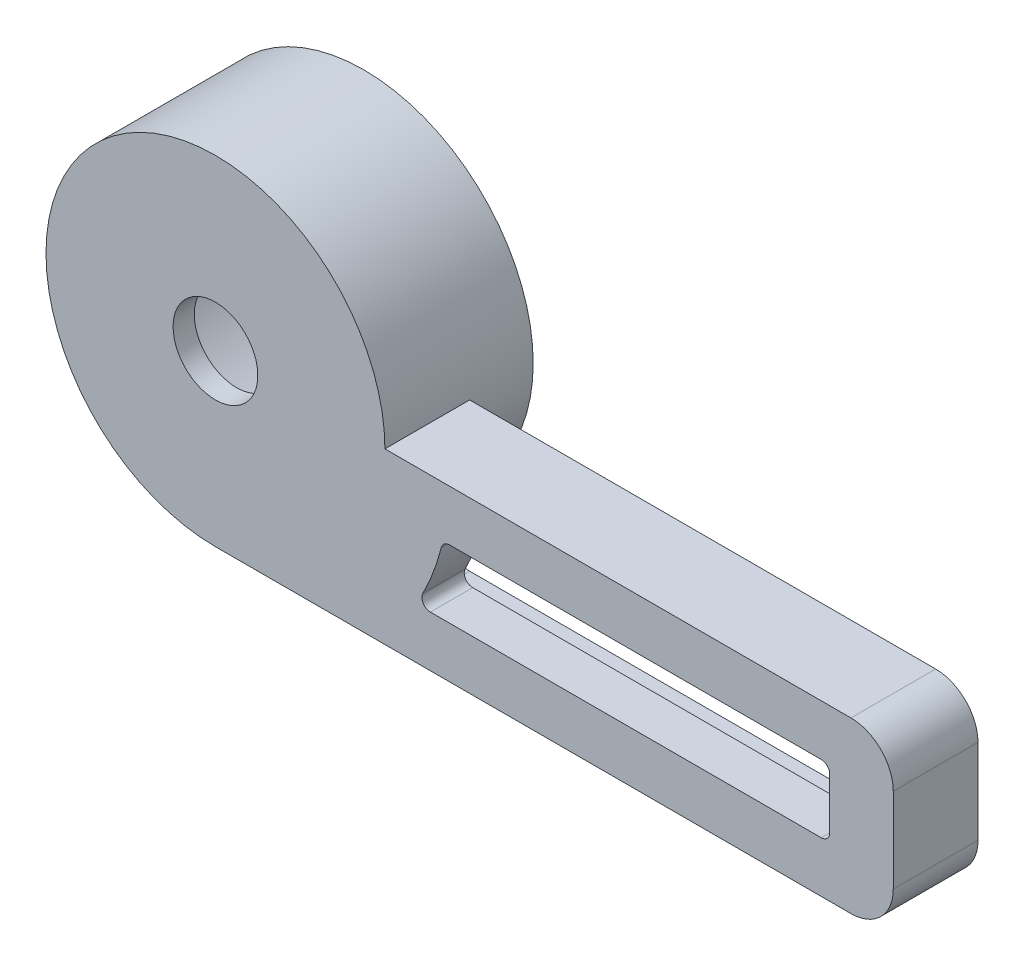
ISO-10303-21;
HEADER;
FILE_DESCRIPTION(('STEP AP214'),'2;1');
FILE_NAME('part.step','',(''),(''),'','','');
FILE_SCHEMA(('AUTOMOTIVE_DESIGN { 1 0 10303 214 1 1 1 1 }'));
ENDSEC;
DATA;
#1=APPLICATION_CONTEXT('core data for automotive mechanical design processes');
#2=APPLICATION_PROTOCOL_DEFINITION('international standard','automotive_design',2000,#1);
#3=PRODUCT_CONTEXT('',#1,'mechanical');
#4=PRODUCT('Part','Part','',(#3));
#5=PRODUCT_RELATED_PRODUCT_CATEGORY('part','',(#4));
#6=PRODUCT_DEFINITION_FORMATION('','',#4);
#7=PRODUCT_DEFINITION_CONTEXT('part definition',#1,'design');
#8=PRODUCT_DEFINITION('design','',#6,#7);
#9=PRODUCT_DEFINITION_SHAPE('','',#8);
#10=(LENGTH_UNIT() NAMED_UNIT(*) SI_UNIT(.MILLI.,.METRE.));
#11=(NAMED_UNIT(*) PLANE_ANGLE_UNIT() SI_UNIT($,.RADIAN.));
#12=(NAMED_UNIT(*) SI_UNIT($,.STERADIAN.) SOLID_ANGLE_UNIT());
#13=UNCERTAINTY_MEASURE_WITH_UNIT(LENGTH_MEASURE(1.E-05),#10,'distance_accuracy_value','');
#14=(GEOMETRIC_REPRESENTATION_CONTEXT(3) GLOBAL_UNCERTAINTY_ASSIGNED_CONTEXT((#13)) GLOBAL_UNIT_ASSIGNED_CONTEXT((#10,
#11,#12)) REPRESENTATION_CONTEXT('',''));
#15=CARTESIAN_POINT('',(0.,0.,0.));
#16=DIRECTION('',(0.,0.,1.));
#17=DIRECTION('',(1.,0.,0.));
#18=AXIS2_PLACEMENT_3D('',#15,#16,#17);
#19=CARTESIAN_POINT('',(-60.,20.,-20.));
#20=DIRECTION('',(0.,-1.,0.));
#21=DIRECTION('',(0.,0.,-1.));
#22=AXIS2_PLACEMENT_3D('',#19,#20,#21);
#23=PLANE('',#22);
#24=DIRECTION('',(1.,0.,0.));
#25=VECTOR('',#24,1.);
#26=CARTESIAN_POINT('',(-60.,20.,-20.));
#27=LINE('',#26,#25);
#28=CARTESIAN_POINT('',(-20.,20.,-20.));
#29=VERTEX_POINT('',#28);
#30=CARTESIAN_POINT('',(89.9999999999999,20.,-20.));
#31=VERTEX_POINT('',#30);
#32=EDGE_CURVE('E360',#29,#31,#27,.T.);
#33=ORIENTED_EDGE('',*,*,#32,.F.);
#34=DIRECTION('',(0.,0.,1.));
#35=VECTOR('',#34,1.);
#36=CARTESIAN_POINT('',(-20.,20.,-35.));
#37=LINE('',#36,#35);
#38=CARTESIAN_POINT('',(-20.,20.,0.));
#39=VERTEX_POINT('',#38);
#40=EDGE_CURVE('E336',#29,#39,#37,.T.);
#41=ORIENTED_EDGE('',*,*,#40,.T.);
#42=DIRECTION('',(1.,0.,0.));
#43=VECTOR('',#42,1.);
#44=CARTESIAN_POINT('',(-60.,20.,0.));
#45=LINE('',#44,#43);
#46=CARTESIAN_POINT('',(89.9999999999999,20.,0.));
#47=VERTEX_POINT('',#46);
#48=EDGE_CURVE('E348',#39,#47,#45,.T.);
#49=ORIENTED_EDGE('',*,*,#48,.T.);
#50=DIRECTION('',(0.,0.,1.));
#51=VECTOR('',#50,1.);
#52=CARTESIAN_POINT('',(89.9999999999999,20.,-20.));
#53=LINE('',#52,#51);
#54=EDGE_CURVE('E11',#31,#47,#53,.T.);
#55=ORIENTED_EDGE('',*,*,#54,.F.);
#56=EDGE_LOOP('',(#33,#41,#49,#55));
#57=FACE_BOUND('',#56,.T.);
#58=ADVANCED_FACE('F38',(#57),#23,.F.);
#59=CARTESIAN_POINT('',(90.,10.,-20.));
#60=DIRECTION('',(0.,0.,1.));
#61=DIRECTION('',(1.,0.,0.));
#62=AXIS2_PLACEMENT_3D('',#59,#60,#61);
#63=CYLINDRICAL_SURFACE('',#62,10.);
#64=CARTESIAN_POINT('',(90.,10.,0.));
#65=DIRECTION('',(0.,0.,-1.));
#66=DIRECTION('',(-1.,0.,0.));
#67=AXIS2_PLACEMENT_3D('',#64,#65,#66);
#68=CIRCLE('',#67,10.);
#69=CARTESIAN_POINT('',(100.,9.99999999999993,0.));
#70=VERTEX_POINT('',#69);
#71=EDGE_CURVE('E345',#47,#70,#68,.T.);
#72=ORIENTED_EDGE('',*,*,#71,.T.);
#73=DIRECTION('',(0.,0.,1.));
#74=VECTOR('',#73,1.);
#75=CARTESIAN_POINT('',(100.,9.99999999999993,-20.));
#76=LINE('',#75,#74);
#77=CARTESIAN_POINT('',(100.,9.99999999999993,-20.));
#78=VERTEX_POINT('',#77);
#79=EDGE_CURVE('E47',#78,#70,#76,.T.);
#80=ORIENTED_EDGE('',*,*,#79,.F.);
#81=CARTESIAN_POINT('',(90.,10.,-20.));
#82=DIRECTION('',(0.,0.,-1.));
#83=DIRECTION('',(-1.,0.,0.));
#84=AXIS2_PLACEMENT_3D('',#81,#82,#83);
#85=CIRCLE('',#84,10.);
#86=EDGE_CURVE('E358',#31,#78,#85,.T.);
#87=ORIENTED_EDGE('',*,*,#86,.F.);
#88=ORIENTED_EDGE('',*,*,#54,.T.);
#89=EDGE_LOOP('',(#72,#80,#87,#88));
#90=FACE_BOUND('',#89,.T.);
#91=ADVANCED_FACE('F385',(#90),#63,.T.);
#92=CARTESIAN_POINT('',(100.,-9.99999999999993,-20.));
#93=DIRECTION('',(1.,0.,0.));
#94=DIRECTION('',(0.,0.,-1.));
#95=AXIS2_PLACEMENT_3D('',#92,#93,#94);
#96=PLANE('',#95);
#97=DIRECTION('',(0.,1.,0.));
#98=VECTOR('',#97,1.);
#99=CARTESIAN_POINT('',(100.,-9.99999999999993,0.));
#100=LINE('',#99,#98);
#101=CARTESIAN_POINT('',(100.,-9.99999999999993,0.));
#102=VERTEX_POINT('',#101);
#103=EDGE_CURVE('E342',#102,#70,#100,.T.);
#104=ORIENTED_EDGE('',*,*,#103,.F.);
#105=DIRECTION('',(0.,0.,1.));
#106=VECTOR('',#105,1.);
#107=CARTESIAN_POINT('',(100.,-9.99999999999993,-20.));
#108=LINE('',#107,#106);
#109=CARTESIAN_POINT('',(100.,-9.99999999999993,-20.));
#110=VERTEX_POINT('',#109);
#111=EDGE_CURVE('E363',#110,#102,#108,.T.);
#112=ORIENTED_EDGE('',*,*,#111,.F.);
#113=DIRECTION('',(0.,1.,0.));
#114=VECTOR('',#113,1.);
#115=CARTESIAN_POINT('',(100.,-9.99999999999993,-20.));
#116=LINE('',#115,#114);
#117=EDGE_CURVE('E355',#110,#78,#116,.T.);
#118=ORIENTED_EDGE('',*,*,#117,.T.);
#119=ORIENTED_EDGE('',*,*,#79,.T.);
#120=EDGE_LOOP('',(#104,#112,#118,#119));
#121=FACE_BOUND('',#120,.T.);
#122=ADVANCED_FACE('F399',(#121),#96,.T.);
#123=CARTESIAN_POINT('',(90.,-10.,-20.));
#124=DIRECTION('',(0.,0.,1.));
#125=DIRECTION('',(1.,0.,0.));
#126=AXIS2_PLACEMENT_3D('',#123,#124,#125);
#127=CYLINDRICAL_SURFACE('',#126,10.);
#128=CARTESIAN_POINT('',(90.,-10.,0.));
#129=DIRECTION('',(0.,0.,-1.));
#130=DIRECTION('',(-1.,0.,0.));
#131=AXIS2_PLACEMENT_3D('',#128,#129,#130);
#132=CIRCLE('',#131,10.);
#133=CARTESIAN_POINT('',(89.9999999999999,-20.,0.));
#134=VERTEX_POINT('',#133);
#135=EDGE_CURVE('E340',#102,#134,#132,.T.);
#136=ORIENTED_EDGE('',*,*,#135,.T.);
#137=DIRECTION('',(0.,0.,1.));
#138=VECTOR('',#137,1.);
#139=CARTESIAN_POINT('',(89.9999999999999,-20.,-20.));
#140=LINE('',#139,#138);
#141=CARTESIAN_POINT('',(89.9999999999999,-20.,-20.));
#142=VERTEX_POINT('',#141);
#143=EDGE_CURVE('E364',#142,#134,#140,.T.);
#144=ORIENTED_EDGE('',*,*,#143,.F.);
#145=CARTESIAN_POINT('',(90.,-10.,-20.));
#146=DIRECTION('',(0.,0.,-1.));
#147=DIRECTION('',(-1.,0.,0.));
#148=AXIS2_PLACEMENT_3D('',#145,#146,#147);
#149=CIRCLE('',#148,10.);
#150=EDGE_CURVE('E353',#110,#142,#149,.T.);
#151=ORIENTED_EDGE('',*,*,#150,.F.);
#152=ORIENTED_EDGE('',*,*,#111,.T.);
#153=EDGE_LOOP('',(#136,#144,#151,#152));
#154=FACE_BOUND('',#153,.T.);
#155=ADVANCED_FACE('F392',(#154),#127,.T.);
#156=CARTESIAN_POINT('',(89.9999999999999,-20.,-20.));
#157=DIRECTION('',(0.,1.,0.));
#158=DIRECTION('',(0.,0.,1.));
#159=AXIS2_PLACEMENT_3D('',#156,#157,#158);
#160=PLANE('',#159);
#161=DIRECTION('',(-1.,0.,0.));
#162=VECTOR('',#161,1.);
#163=CARTESIAN_POINT('',(89.9999999999999,-20.,0.));
#164=LINE('',#163,#162);
#165=CARTESIAN_POINT('',(-60.,-20.,0.));
#166=VERTEX_POINT('',#165);
#167=EDGE_CURVE('E338',#134,#166,#164,.T.);
#168=ORIENTED_EDGE('',*,*,#167,.T.);
#169=DIRECTION('',(0.,0.,1.));
#170=VECTOR('',#169,1.);
#171=CARTESIAN_POINT('',(-60.,-20.,-20.));
#172=LINE('',#171,#170);
#173=CARTESIAN_POINT('',(-60.,-20.,-20.));
#174=VERTEX_POINT('',#173);
#175=EDGE_CURVE('E42',#174,#166,#172,.T.);
#176=ORIENTED_EDGE('',*,*,#175,.F.);
#177=DIRECTION('',(-1.,0.,0.));
#178=VECTOR('',#177,1.);
#179=CARTESIAN_POINT('',(89.9999999999999,-20.,-20.));
#180=LINE('',#179,#178);
#181=EDGE_CURVE('E350',#142,#174,#180,.T.);
#182=ORIENTED_EDGE('',*,*,#181,.F.);
#183=ORIENTED_EDGE('',*,*,#143,.T.);
#184=EDGE_LOOP('',(#168,#176,#182,#183));
#185=FACE_BOUND('',#184,.T.);
#186=ADVANCED_FACE('F40',(#185),#160,.F.);
#187=CARTESIAN_POINT('',(90.,-10.,-20.));
#188=DIRECTION('',(0.,0.,-1.));
#189=DIRECTION('',(-1.,0.,0.));
#190=AXIS2_PLACEMENT_3D('',#187,#188,#189);
#191=PLANE('',#190);
#192=CARTESIAN_POINT('',(90.,-10.,-20.));
#193=DIRECTION('',(0.,0.,-1.));
#194=DIRECTION('',(-1.,0.,0.));
#195=AXIS2_PLACEMENT_3D('',#192,#193,#194);
#196=CIRCLE('',#195,4.99999999999999);
#197=CARTESIAN_POINT('',(95.,-9.99999999999993,-20.));
#198=VERTEX_POINT('',#197);
#199=CARTESIAN_POINT('',(90.,-15.,-20.));
#200=VERTEX_POINT('',#199);
#201=EDGE_CURVE('E260',#198,#200,#196,.T.);
#202=ORIENTED_EDGE('',*,*,#201,.F.);
#203=DIRECTION('',(0.,1.,0.));
#204=VECTOR('',#203,1.);
#205=CARTESIAN_POINT('',(95.,-9.99999999999993,-20.));
#206=LINE('',#205,#204);
#207=CARTESIAN_POINT('',(95.,9.99999999999997,-20.));
#208=VERTEX_POINT('',#207);
#209=EDGE_CURVE('E280',#198,#208,#206,.T.);
#210=ORIENTED_EDGE('',*,*,#209,.T.);
#211=CARTESIAN_POINT('',(90.,10.,-20.));
#212=DIRECTION('',(0.,0.,-1.));
#213=DIRECTION('',(-1.,0.,0.));
#214=AXIS2_PLACEMENT_3D('',#211,#212,#213);
#215=CIRCLE('',#214,4.99999999999999);
#216=CARTESIAN_POINT('',(89.9999999999999,15.,-20.));
#217=VERTEX_POINT('',#216);
#218=EDGE_CURVE('E277',#217,#208,#215,.T.);
#219=ORIENTED_EDGE('',*,*,#218,.F.);
#220=DIRECTION('',(1.,0.,0.));
#221=VECTOR('',#220,1.);
#222=CARTESIAN_POINT('',(-11.0102051443365,15.,-20.));
#223=LINE('',#222,#221);
#224=CARTESIAN_POINT('',(-11.0102051443365,15.,-20.));
#225=VERTEX_POINT('',#224);
#226=EDGE_CURVE('E274',#225,#217,#223,.T.);
#227=ORIENTED_EDGE('',*,*,#226,.F.);
#228=CARTESIAN_POINT('',(-11.0102051443365,10.,-20.));
#229=DIRECTION('',(0.,0.,1.));
#230=DIRECTION('',(1.,0.,0.));
#231=AXIS2_PLACEMENT_3D('',#228,#229,#230);
#232=CIRCLE('',#231,5.);
#233=CARTESIAN_POINT('',(-15.9091846299028,11.,-20.));
#234=VERTEX_POINT('',#233);
#235=EDGE_CURVE('E271',#225,#234,#232,.T.);
#236=ORIENTED_EDGE('',*,*,#235,.T.);
#237=CARTESIAN_POINT('',(-60.,20.,-20.));
#238=DIRECTION('',(0.,0.,-1.));
#239=DIRECTION('',(-1.,0.,0.));
#240=AXIS2_PLACEMENT_3D('',#237,#238,#239);
#241=CIRCLE('',#240,45.);
#242=CARTESIAN_POINT('',(-24.,-7.,-20.));
#243=VERTEX_POINT('',#242);
#244=EDGE_CURVE('E268',#234,#243,#241,.T.);
#245=ORIENTED_EDGE('',*,*,#244,.T.);
#246=CARTESIAN_POINT('',(-20.,-10.,-20.));
#247=DIRECTION('',(0.,0.,1.));
#248=DIRECTION('',(1.,0.,0.));
#249=AXIS2_PLACEMENT_3D('',#246,#247,#248);
#250=CIRCLE('',#249,5.00000000000001);
#251=CARTESIAN_POINT('',(-20.,-15.,-20.));
#252=VERTEX_POINT('',#251);
#253=EDGE_CURVE('E265',#243,#252,#250,.T.);
#254=ORIENTED_EDGE('',*,*,#253,.T.);
#255=DIRECTION('',(-1.,0.,0.));
#256=VECTOR('',#255,1.);
#257=CARTESIAN_POINT('',(90.,-15.,-20.));
#258=LINE('',#257,#256);
#259=EDGE_CURVE('E262',#200,#252,#258,.T.);
#260=ORIENTED_EDGE('',*,*,#259,.F.);
#261=EDGE_LOOP('',(#202,#210,#219,#227,#236,#245,#254,#260));
#262=FACE_BOUND('',#261,.T.);
#263=CARTESIAN_POINT('',(-60.,20.,-20.));
#264=DIRECTION('',(0.,0.,-1.));
#265=DIRECTION('',(-1.,0.,0.));
#266=AXIS2_PLACEMENT_3D('',#263,#264,#265);
#267=CIRCLE('',#266,40.);
#268=EDGE_CURVE('E333',#29,#174,#267,.T.);
#269=ORIENTED_EDGE('',*,*,#268,.F.);
#270=ORIENTED_EDGE('',*,*,#32,.T.);
#271=ORIENTED_EDGE('',*,*,#86,.T.);
#272=ORIENTED_EDGE('',*,*,#117,.F.);
#273=ORIENTED_EDGE('',*,*,#150,.T.);
#274=ORIENTED_EDGE('',*,*,#181,.T.);
#275=EDGE_LOOP('',(#269,#270,#271,#272,#273,#274));
#276=FACE_BOUND('',#275,.T.);
#277=ADVANCED_FACE('F389',(#262,#276),#191,.T.);
#278=CARTESIAN_POINT('',(90.,-10.,0.));
#279=DIRECTION('',(0.,0.,-1.));
#280=DIRECTION('',(-1.,0.,0.));
#281=AXIS2_PLACEMENT_3D('',#278,#279,#280);
#282=PLANE('',#281);
#283=DIRECTION('',(0.,1.,0.));
#284=VECTOR('',#283,1.);
#285=CARTESIAN_POINT('',(85.,-5.99999999999998,0.));
#286=LINE('',#285,#284);
#287=CARTESIAN_POINT('',(85.,-5.99999999999998,0.));
#288=VERTEX_POINT('',#287);
#289=CARTESIAN_POINT('',(85.,5.99999999999998,0.));
#290=VERTEX_POINT('',#289);
#291=EDGE_CURVE('E240',#288,#290,#286,.T.);
#292=ORIENTED_EDGE('',*,*,#291,.F.);
#293=CARTESIAN_POINT('',(83.,-6.,0.));
#294=DIRECTION('',(0.,0.,-1.));
#295=DIRECTION('',(-1.,0.,0.));
#296=AXIS2_PLACEMENT_3D('',#293,#294,#295);
#297=CIRCLE('',#296,2.);
#298=CARTESIAN_POINT('',(83.,-8.,0.));
#299=VERTEX_POINT('',#298);
#300=EDGE_CURVE('E225',#288,#299,#297,.T.);
#301=ORIENTED_EDGE('',*,*,#300,.T.);
#302=DIRECTION('',(-1.,0.,0.));
#303=VECTOR('',#302,1.);
#304=CARTESIAN_POINT('',(83.,-8.,0.));
#305=LINE('',#304,#303);
#306=CARTESIAN_POINT('',(-9.27525258811042,-8.,0.));
#307=VERTEX_POINT('',#306);
#308=EDGE_CURVE('E228',#299,#307,#305,.T.);
#309=ORIENTED_EDGE('',*,*,#308,.T.);
#310=CARTESIAN_POINT('',(-9.27525258811043,-6.,0.));
#311=DIRECTION('',(0.,0.,1.));
#312=DIRECTION('',(1.,0.,0.));
#313=AXIS2_PLACEMENT_3D('',#310,#311,#312);
#314=CIRCLE('',#313,2.);
#315=CARTESIAN_POINT('',(-11.0550682867732,-5.0877192982456,0.));
#316=VERTEX_POINT('',#315);
#317=EDGE_CURVE('E195',#316,#307,#314,.T.);
#318=ORIENTED_EDGE('',*,*,#317,.F.);
#319=CARTESIAN_POINT('',(-60.,20.,0.));
#320=DIRECTION('',(0.,0.,-1.));
#321=DIRECTION('',(-1.,0.,0.));
#322=AXIS2_PLACEMENT_3D('',#319,#320,#321);
#323=CIRCLE('',#322,55.);
#324=CARTESIAN_POINT('',(-6.68477627405112,6.49122807017544,0.));
#325=VERTEX_POINT('',#324);
#326=EDGE_CURVE('E231',#325,#316,#323,.T.);
#327=ORIENTED_EDGE('',*,*,#326,.F.);
#328=CARTESIAN_POINT('',(-4.7460408658348,6.,0.));
#329=DIRECTION('',(0.,0.,1.));
#330=DIRECTION('',(1.,0.,0.));
#331=AXIS2_PLACEMENT_3D('',#328,#329,#330);
#332=CIRCLE('',#331,2.);
#333=CARTESIAN_POINT('',(-4.7460408658348,8.,0.));
#334=VERTEX_POINT('',#333);
#335=EDGE_CURVE('E233',#334,#325,#332,.T.);
#336=ORIENTED_EDGE('',*,*,#335,.F.);
#337=DIRECTION('',(1.,0.,0.));
#338=VECTOR('',#337,1.);
#339=CARTESIAN_POINT('',(-4.7460408658348,8.,0.));
#340=LINE('',#339,#338);
#341=CARTESIAN_POINT('',(83.,8.,0.));
#342=VERTEX_POINT('',#341);
#343=EDGE_CURVE('E235',#334,#342,#340,.T.);
#344=ORIENTED_EDGE('',*,*,#343,.T.);
#345=CARTESIAN_POINT('',(83.,6.,0.));
#346=DIRECTION('',(0.,0.,1.));
#347=DIRECTION('',(1.,0.,0.));
#348=AXIS2_PLACEMENT_3D('',#345,#346,#347);
#349=CIRCLE('',#348,2.);
#350=EDGE_CURVE('E238',#290,#342,#349,.T.);
#351=ORIENTED_EDGE('',*,*,#350,.F.);
#352=EDGE_LOOP('',(#292,#301,#309,#318,#327,#336,#344,#351));
#353=FACE_BOUND('',#352,.T.);
#354=CARTESIAN_POINT('',(-60.,20.,0.));
#355=DIRECTION('',(0.,0.,-1.));
#356=DIRECTION('',(-1.,0.,0.));
#357=AXIS2_PLACEMENT_3D('',#354,#355,#356);
#358=CIRCLE('',#357,10.);
#359=CARTESIAN_POINT('',(-70.,20.,0.));
#360=VERTEX_POINT('',#359);
#361=EDGE_CURVE('E257',#360,#360,#358,.T.);
#362=ORIENTED_EDGE('',*,*,#361,.T.);
#363=EDGE_LOOP('',(#362));
#364=FACE_BOUND('',#363,.T.);
#365=CARTESIAN_POINT('',(-60.,20.,0.));
#366=DIRECTION('',(0.,0.,1.));
#367=DIRECTION('',(1.,0.,0.));
#368=AXIS2_PLACEMENT_3D('',#365,#366,#367);
#369=CIRCLE('',#368,40.);
#370=EDGE_CURVE('E327',#39,#166,#369,.T.);
#371=ORIENTED_EDGE('',*,*,#370,.T.);
#372=ORIENTED_EDGE('',*,*,#167,.F.);
#373=ORIENTED_EDGE('',*,*,#135,.F.);
#374=ORIENTED_EDGE('',*,*,#103,.T.);
#375=ORIENTED_EDGE('',*,*,#71,.F.);
#376=ORIENTED_EDGE('',*,*,#48,.F.);
#377=EDGE_LOOP('',(#371,#372,#373,#374,#375,#376));
#378=FACE_BOUND('',#377,.T.);
#379=ADVANCED_FACE('F377',(#353,#364,#378),#282,.F.);
#380=CARTESIAN_POINT('',(-60.,20.,-35.));
#381=DIRECTION('',(0.,0.,1.));
#382=DIRECTION('',(1.,0.,0.));
#383=AXIS2_PLACEMENT_3D('',#380,#381,#382);
#384=CYLINDRICAL_SURFACE('',#383,40.);
#385=CARTESIAN_POINT('',(-60.,20.,-35.));
#386=DIRECTION('',(0.,0.,1.));
#387=DIRECTION('',(1.,0.,0.));
#388=AXIS2_PLACEMENT_3D('',#385,#386,#387);
#389=CIRCLE('',#388,40.);
#390=CARTESIAN_POINT('',(-20.,20.,-35.));
#391=VERTEX_POINT('',#390);
#392=EDGE_CURVE('E330',#391,#391,#389,.T.);
#393=ORIENTED_EDGE('',*,*,#392,.T.);
#394=EDGE_LOOP('',(#393));
#395=FACE_BOUND('',#394,.T.);
#396=ORIENTED_EDGE('',*,*,#40,.F.);
#397=ORIENTED_EDGE('',*,*,#268,.T.);
#398=ORIENTED_EDGE('',*,*,#175,.T.);
#399=ORIENTED_EDGE('',*,*,#370,.F.);
#400=EDGE_LOOP('',(#396,#397,#398,#399));
#401=FACE_BOUND('',#400,.T.);
#402=ADVANCED_FACE('F374',(#395,#401),#384,.T.);
#403=CARTESIAN_POINT('',(-60.,20.,-35.));
#404=DIRECTION('',(0.,0.,1.));
#405=DIRECTION('',(1.,0.,0.));
#406=AXIS2_PLACEMENT_3D('',#403,#404,#405);
#407=PLANE('',#406);
#408=CARTESIAN_POINT('',(-60.,20.,-35.));
#409=DIRECTION('',(0.,0.,-1.));
#410=DIRECTION('',(-1.,0.,0.));
#411=AXIS2_PLACEMENT_3D('',#408,#409,#410);
#412=CIRCLE('',#411,35.);
#413=CARTESIAN_POINT('',(-95.,20.,-35.));
#414=VERTEX_POINT('',#413);
#415=EDGE_CURVE('E306',#414,#414,#412,.T.);
#416=ORIENTED_EDGE('',*,*,#415,.F.);
#417=EDGE_LOOP('',(#416));
#418=FACE_BOUND('',#417,.T.);
#419=ORIENTED_EDGE('',*,*,#392,.F.);
#420=EDGE_LOOP('',(#419));
#421=FACE_BOUND('',#420,.T.);
#422=ADVANCED_FACE('F452',(#418,#421),#407,.F.);
#423=CARTESIAN_POINT('',(-60.,20.,-5.));
#424=DIRECTION('',(0.,0.,-1.));
#425=DIRECTION('',(-1.,0.,0.));
#426=AXIS2_PLACEMENT_3D('',#423,#424,#425);
#427=CYLINDRICAL_SURFACE('',#426,35.);
#428=CARTESIAN_POINT('',(-60.,20.,-5.));
#429=DIRECTION('',(0.,0.,-1.));
#430=DIRECTION('',(-1.,0.,0.));
#431=AXIS2_PLACEMENT_3D('',#428,#429,#430);
#432=CIRCLE('',#431,35.);
#433=CARTESIAN_POINT('',(-95.,20.,-5.));
#434=VERTEX_POINT('',#433);
#435=EDGE_CURVE('E324',#434,#434,#432,.T.);
#436=ORIENTED_EDGE('',*,*,#435,.F.);
#437=EDGE_LOOP('',(#436));
#438=FACE_BOUND('',#437,.T.);
#439=ORIENTED_EDGE('',*,*,#415,.T.);
#440=EDGE_LOOP('',(#439));
#441=FACE_BOUND('',#440,.T.);
#442=ADVANCED_FACE('F463',(#438,#441),#427,.F.);
#443=CARTESIAN_POINT('',(-60.,20.,-5.));
#444=DIRECTION('',(0.,0.,-1.));
#445=DIRECTION('',(-1.,0.,0.));
#446=AXIS2_PLACEMENT_3D('',#443,#444,#445);
#447=PLANE('',#446);
#448=CARTESIAN_POINT('',(-60.,20.,-5.));
#449=DIRECTION('',(0.,0.,-1.));
#450=DIRECTION('',(-1.,0.,0.));
#451=AXIS2_PLACEMENT_3D('',#448,#449,#450);
#452=CIRCLE('',#451,10.);
#453=CARTESIAN_POINT('',(-70.,20.,-5.));
#454=VERTEX_POINT('',#453);
#455=EDGE_CURVE('E244',#454,#454,#452,.T.);
#456=ORIENTED_EDGE('',*,*,#455,.F.);
#457=EDGE_LOOP('',(#456));
#458=FACE_BOUND('',#457,.T.);
#459=ORIENTED_EDGE('',*,*,#435,.T.);
#460=EDGE_LOOP('',(#459));
#461=FACE_BOUND('',#460,.T.);
#462=ADVANCED_FACE('F471',(#458,#461),#447,.T.);
#463=CARTESIAN_POINT('',(90.,-10.,-10.));
#464=DIRECTION('',(0.,0.,-1.));
#465=DIRECTION('',(-1.,0.,0.));
#466=AXIS2_PLACEMENT_3D('',#463,#464,#465);
#467=CYLINDRICAL_SURFACE('',#466,4.99999999999999);
#468=ORIENTED_EDGE('',*,*,#201,.T.);
#469=DIRECTION('',(0.,0.,-1.));
#470=VECTOR('',#469,1.);
#471=CARTESIAN_POINT('',(90.,-15.,-10.));
#472=LINE('',#471,#470);
#473=CARTESIAN_POINT('',(90.,-15.,-10.));
#474=VERTEX_POINT('',#473);
#475=EDGE_CURVE('E303',#474,#200,#472,.T.);
#476=ORIENTED_EDGE('',*,*,#475,.F.);
#477=CARTESIAN_POINT('',(90.,-10.,-10.));
#478=DIRECTION('',(0.,0.,-1.));
#479=DIRECTION('',(-1.,0.,0.));
#480=AXIS2_PLACEMENT_3D('',#477,#478,#479);
#481=CIRCLE('',#480,4.99999999999999);
#482=CARTESIAN_POINT('',(95.,-9.99999999999993,-10.));
#483=VERTEX_POINT('',#482);
#484=EDGE_CURVE('E283',#483,#474,#481,.T.);
#485=ORIENTED_EDGE('',*,*,#484,.F.);
#486=DIRECTION('',(0.,0.,-1.));
#487=VECTOR('',#486,1.);
#488=CARTESIAN_POINT('',(95.,-9.99999999999993,-10.));
#489=LINE('',#488,#487);
#490=EDGE_CURVE('E304',#483,#198,#489,.T.);
#491=ORIENTED_EDGE('',*,*,#490,.T.);
#492=EDGE_LOOP('',(#468,#476,#485,#491));
#493=FACE_BOUND('',#492,.T.);
#494=ADVANCED_FACE('F481',(#493),#467,.F.);
#495=CARTESIAN_POINT('',(95.,-9.99999999999993,-10.));
#496=DIRECTION('',(-1.,0.,0.));
#497=DIRECTION('',(0.,0.,1.));
#498=AXIS2_PLACEMENT_3D('',#495,#496,#497);
#499=PLANE('',#498);
#500=ORIENTED_EDGE('',*,*,#209,.F.);
#501=ORIENTED_EDGE('',*,*,#490,.F.);
#502=DIRECTION('',(0.,1.,0.));
#503=VECTOR('',#502,1.);
#504=CARTESIAN_POINT('',(95.,-9.99999999999993,-10.));
#505=LINE('',#504,#503);
#506=CARTESIAN_POINT('',(95.,9.99999999999997,-10.));
#507=VERTEX_POINT('',#506);
#508=EDGE_CURVE('E301',#483,#507,#505,.T.);
#509=ORIENTED_EDGE('',*,*,#508,.T.);
#510=DIRECTION('',(0.,0.,-1.));
#511=VECTOR('',#510,1.);
#512=CARTESIAN_POINT('',(95.,9.99999999999997,-10.));
#513=LINE('',#512,#511);
#514=EDGE_CURVE('E307',#507,#208,#513,.T.);
#515=ORIENTED_EDGE('',*,*,#514,.T.);
#516=EDGE_LOOP('',(#500,#501,#509,#515));
#517=FACE_BOUND('',#516,.T.);
#518=ADVANCED_FACE('F491',(#517),#499,.T.);
#519=CARTESIAN_POINT('',(90.,10.,-10.));
#520=DIRECTION('',(0.,0.,-1.));
#521=DIRECTION('',(-1.,0.,0.));
#522=AXIS2_PLACEMENT_3D('',#519,#520,#521);
#523=CYLINDRICAL_SURFACE('',#522,4.99999999999999);
#524=ORIENTED_EDGE('',*,*,#218,.T.);
#525=ORIENTED_EDGE('',*,*,#514,.F.);
#526=CARTESIAN_POINT('',(90.,10.,-10.));
#527=DIRECTION('',(0.,0.,-1.));
#528=DIRECTION('',(-1.,0.,0.));
#529=AXIS2_PLACEMENT_3D('',#526,#527,#528);
#530=CIRCLE('',#529,4.99999999999999);
#531=CARTESIAN_POINT('',(89.9999999999999,15.,-10.));
#532=VERTEX_POINT('',#531);
#533=EDGE_CURVE('E298',#532,#507,#530,.T.);
#534=ORIENTED_EDGE('',*,*,#533,.F.);
#535=DIRECTION('',(0.,0.,-1.));
#536=VECTOR('',#535,1.);
#537=CARTESIAN_POINT('',(89.9999999999999,15.,-10.));
#538=LINE('',#537,#536);
#539=EDGE_CURVE('E309',#532,#217,#538,.T.);
#540=ORIENTED_EDGE('',*,*,#539,.T.);
#541=EDGE_LOOP('',(#524,#525,#534,#540));
#542=FACE_BOUND('',#541,.T.);
#543=ADVANCED_FACE('F502',(#542),#523,.F.);
#544=CARTESIAN_POINT('',(-11.0102051443365,15.,-10.));
#545=DIRECTION('',(0.,1.,0.));
#546=DIRECTION('',(0.,0.,1.));
#547=AXIS2_PLACEMENT_3D('',#544,#545,#546);
#548=PLANE('',#547);
#549=ORIENTED_EDGE('',*,*,#226,.T.);
#550=ORIENTED_EDGE('',*,*,#539,.F.);
#551=DIRECTION('',(1.,0.,0.));
#552=VECTOR('',#551,1.);
#553=CARTESIAN_POINT('',(-11.0102051443365,15.,-10.));
#554=LINE('',#553,#552);
#555=CARTESIAN_POINT('',(-11.0102051443365,15.,-10.));
#556=VERTEX_POINT('',#555);
#557=EDGE_CURVE('E295',#556,#532,#554,.T.);
#558=ORIENTED_EDGE('',*,*,#557,.F.);
#559=DIRECTION('',(0.,0.,-1.));
#560=VECTOR('',#559,1.);
#561=CARTESIAN_POINT('',(-11.0102051443365,15.,-10.));
#562=LINE('',#561,#560);
#563=EDGE_CURVE('E311',#556,#225,#562,.T.);
#564=ORIENTED_EDGE('',*,*,#563,.T.);
#565=EDGE_LOOP('',(#549,#550,#558,#564));
#566=FACE_BOUND('',#565,.T.);
#567=ADVANCED_FACE('F513',(#566),#548,.F.);
#568=CARTESIAN_POINT('',(-11.0102051443365,10.,-10.));
#569=DIRECTION('',(0.,0.,-1.));
#570=DIRECTION('',(-1.,0.,0.));
#571=AXIS2_PLACEMENT_3D('',#568,#569,#570);
#572=CYLINDRICAL_SURFACE('',#571,5.);
#573=ORIENTED_EDGE('',*,*,#235,.F.);
#574=ORIENTED_EDGE('',*,*,#563,.F.);
#575=CARTESIAN_POINT('',(-11.0102051443365,10.,-10.));
#576=DIRECTION('',(0.,0.,1.));
#577=DIRECTION('',(1.,0.,0.));
#578=AXIS2_PLACEMENT_3D('',#575,#576,#577);
#579=CIRCLE('',#578,5.);
#580=CARTESIAN_POINT('',(-15.9091846299028,11.,-10.));
#581=VERTEX_POINT('',#580);
#582=EDGE_CURVE('E293',#556,#581,#579,.T.);
#583=ORIENTED_EDGE('',*,*,#582,.T.);
#584=DIRECTION('',(0.,0.,-1.));
#585=VECTOR('',#584,1.);
#586=CARTESIAN_POINT('',(-15.9091846299028,11.,-10.));
#587=LINE('',#586,#585);
#588=EDGE_CURVE('E313',#581,#234,#587,.T.);
#589=ORIENTED_EDGE('',*,*,#588,.T.);
#590=EDGE_LOOP('',(#573,#574,#583,#589));
#591=FACE_BOUND('',#590,.T.);
#592=ADVANCED_FACE('F524',(#591),#572,.F.);
#593=CARTESIAN_POINT('',(-60.,20.,-10.));
#594=DIRECTION('',(0.,0.,-1.));
#595=DIRECTION('',(-1.,0.,0.));
#596=AXIS2_PLACEMENT_3D('',#593,#594,#595);
#597=CYLINDRICAL_SURFACE('',#596,45.);
#598=ORIENTED_EDGE('',*,*,#244,.F.);
#599=ORIENTED_EDGE('',*,*,#588,.F.);
#600=CARTESIAN_POINT('',(-60.,20.,-10.));
#601=DIRECTION('',(0.,0.,-1.));
#602=DIRECTION('',(-1.,0.,0.));
#603=AXIS2_PLACEMENT_3D('',#600,#601,#602);
#604=CIRCLE('',#603,45.);
#605=CARTESIAN_POINT('',(-24.,-7.,-10.));
#606=VERTEX_POINT('',#605);
#607=EDGE_CURVE('E291',#581,#606,#604,.T.);
#608=ORIENTED_EDGE('',*,*,#607,.T.);
#609=DIRECTION('',(0.,0.,-1.));
#610=VECTOR('',#609,1.);
#611=CARTESIAN_POINT('',(-24.,-7.,-10.));
#612=LINE('',#611,#610);
#613=EDGE_CURVE('E315',#606,#243,#612,.T.);
#614=ORIENTED_EDGE('',*,*,#613,.T.);
#615=EDGE_LOOP('',(#598,#599,#608,#614));
#616=FACE_BOUND('',#615,.T.);
#617=ADVANCED_FACE('F535',(#616),#597,.T.);
#618=CARTESIAN_POINT('',(-20.,-10.,-10.));
#619=DIRECTION('',(0.,0.,-1.));
#620=DIRECTION('',(-1.,0.,0.));
#621=AXIS2_PLACEMENT_3D('',#618,#619,#620);
#622=CYLINDRICAL_SURFACE('',#621,5.00000000000001);
#623=ORIENTED_EDGE('',*,*,#253,.F.);
#624=ORIENTED_EDGE('',*,*,#613,.F.);
#625=CARTESIAN_POINT('',(-20.,-10.,-10.));
#626=DIRECTION('',(0.,0.,1.));
#627=DIRECTION('',(1.,0.,0.));
#628=AXIS2_PLACEMENT_3D('',#625,#626,#627);
#629=CIRCLE('',#628,5.00000000000001);
#630=CARTESIAN_POINT('',(-20.,-15.,-10.));
#631=VERTEX_POINT('',#630);
#632=EDGE_CURVE('E289',#606,#631,#629,.T.);
#633=ORIENTED_EDGE('',*,*,#632,.T.);
#634=DIRECTION('',(0.,0.,-1.));
#635=VECTOR('',#634,1.);
#636=CARTESIAN_POINT('',(-20.,-15.,-10.));
#637=LINE('',#636,#635);
#638=EDGE_CURVE('E317',#631,#252,#637,.T.);
#639=ORIENTED_EDGE('',*,*,#638,.T.);
#640=EDGE_LOOP('',(#623,#624,#633,#639));
#641=FACE_BOUND('',#640,.T.);
#642=ADVANCED_FACE('F546',(#641),#622,.F.);
#643=CARTESIAN_POINT('',(90.,-15.,-10.));
#644=DIRECTION('',(0.,-1.,0.));
#645=DIRECTION('',(1.,0.,0.));
#646=AXIS2_PLACEMENT_3D('',#643,#644,#645);
#647=PLANE('',#646);
#648=ORIENTED_EDGE('',*,*,#259,.T.);
#649=ORIENTED_EDGE('',*,*,#638,.F.);
#650=DIRECTION('',(-1.,0.,0.));
#651=VECTOR('',#650,1.);
#652=CARTESIAN_POINT('',(90.,-15.,-10.));
#653=LINE('',#652,#651);
#654=EDGE_CURVE('E286',#474,#631,#653,.T.);
#655=ORIENTED_EDGE('',*,*,#654,.F.);
#656=ORIENTED_EDGE('',*,*,#475,.T.);
#657=EDGE_LOOP('',(#648,#649,#655,#656));
#658=FACE_BOUND('',#657,.T.);
#659=ADVANCED_FACE('F557',(#658),#647,.F.);
#660=CARTESIAN_POINT('',(90.,-10.,-10.));
#661=DIRECTION('',(0.,0.,-1.));
#662=DIRECTION('',(-1.,0.,0.));
#663=AXIS2_PLACEMENT_3D('',#660,#661,#662);
#664=PLANE('',#663);
#665=CARTESIAN_POINT('',(83.,-6.,-10.));
#666=DIRECTION('',(0.,0.,-1.));
#667=DIRECTION('',(-1.,0.,0.));
#668=AXIS2_PLACEMENT_3D('',#665,#666,#667);
#669=CIRCLE('',#668,2.);
#670=CARTESIAN_POINT('',(85.,-5.99999999999998,-10.));
#671=VERTEX_POINT('',#670);
#672=CARTESIAN_POINT('',(83.,-8.,-10.));
#673=VERTEX_POINT('',#672);
#674=EDGE_CURVE('E63',#671,#673,#669,.T.);
#675=ORIENTED_EDGE('',*,*,#674,.F.);
#676=DIRECTION('',(0.,1.,0.));
#677=VECTOR('',#676,1.);
#678=CARTESIAN_POINT('',(85.,-5.99999999999998,-10.));
#679=LINE('',#678,#677);
#680=CARTESIAN_POINT('',(85.,5.99999999999998,-10.));
#681=VERTEX_POINT('',#680);
#682=EDGE_CURVE('E222',#671,#681,#679,.T.);
#683=ORIENTED_EDGE('',*,*,#682,.T.);
#684=CARTESIAN_POINT('',(83.,6.,-10.));
#685=DIRECTION('',(0.,0.,1.));
#686=DIRECTION('',(1.,0.,0.));
#687=AXIS2_PLACEMENT_3D('',#684,#685,#686);
#688=CIRCLE('',#687,2.);
#689=CARTESIAN_POINT('',(83.,8.,-10.));
#690=VERTEX_POINT('',#689);
#691=EDGE_CURVE('E219',#681,#690,#688,.T.);
#692=ORIENTED_EDGE('',*,*,#691,.T.);
#693=DIRECTION('',(1.,0.,0.));
#694=VECTOR('',#693,1.);
#695=CARTESIAN_POINT('',(-4.7460408658348,8.,-10.));
#696=LINE('',#695,#694);
#697=CARTESIAN_POINT('',(-4.7460408658348,8.,-10.));
#698=VERTEX_POINT('',#697);
#699=EDGE_CURVE('E216',#698,#690,#696,.T.);
#700=ORIENTED_EDGE('',*,*,#699,.F.);
#701=CARTESIAN_POINT('',(-4.7460408658348,6.,-10.));
#702=DIRECTION('',(0.,0.,1.));
#703=DIRECTION('',(1.,0.,0.));
#704=AXIS2_PLACEMENT_3D('',#701,#702,#703);
#705=CIRCLE('',#704,2.);
#706=CARTESIAN_POINT('',(-6.68477627405112,6.49122807017544,-10.));
#707=VERTEX_POINT('',#706);
#708=EDGE_CURVE('E211',#698,#707,#705,.T.);
#709=ORIENTED_EDGE('',*,*,#708,.T.);
#710=CARTESIAN_POINT('',(-60.,20.,-10.));
#711=DIRECTION('',(0.,0.,-1.));
#712=DIRECTION('',(-1.,0.,0.));
#713=AXIS2_PLACEMENT_3D('',#710,#711,#712);
#714=CIRCLE('',#713,55.);
#715=CARTESIAN_POINT('',(-11.0550682867732,-5.0877192982456,-10.));
#716=VERTEX_POINT('',#715);
#717=EDGE_CURVE('E209',#707,#716,#714,.T.);
#718=ORIENTED_EDGE('',*,*,#717,.T.);
#719=CARTESIAN_POINT('',(-9.27525258811043,-6.,-10.));
#720=DIRECTION('',(0.,0.,1.));
#721=DIRECTION('',(1.,0.,0.));
#722=AXIS2_PLACEMENT_3D('',#719,#720,#721);
#723=CIRCLE('',#722,2.);
#724=CARTESIAN_POINT('',(-9.27525258811043,-8.,-10.));
#725=VERTEX_POINT('',#724);
#726=EDGE_CURVE('E192',#716,#725,#723,.T.);
#727=ORIENTED_EDGE('',*,*,#726,.T.);
#728=DIRECTION('',(-1.,0.,0.));
#729=VECTOR('',#728,1.);
#730=CARTESIAN_POINT('',(83.,-8.,-10.));
#731=LINE('',#730,#729);
#732=EDGE_CURVE('E201',#673,#725,#731,.T.);
#733=ORIENTED_EDGE('',*,*,#732,.F.);
#734=EDGE_LOOP('',(#675,#683,#692,#700,#709,#718,#727,#733));
#735=FACE_BOUND('',#734,.T.);
#736=ORIENTED_EDGE('',*,*,#484,.T.);
#737=ORIENTED_EDGE('',*,*,#654,.T.);
#738=ORIENTED_EDGE('',*,*,#632,.F.);
#739=ORIENTED_EDGE('',*,*,#607,.F.);
#740=ORIENTED_EDGE('',*,*,#582,.F.);
#741=ORIENTED_EDGE('',*,*,#557,.T.);
#742=ORIENTED_EDGE('',*,*,#533,.T.);
#743=ORIENTED_EDGE('',*,*,#508,.F.);
#744=EDGE_LOOP('',(#736,#737,#738,#739,#740,#741,#742,#743));
#745=FACE_BOUND('',#744,.T.);
#746=ADVANCED_FACE('F205',(#735,#745),#664,.T.);
#747=CARTESIAN_POINT('',(-60.,20.,0.));
#748=DIRECTION('',(0.,0.,-1.));
#749=DIRECTION('',(-1.,0.,0.));
#750=AXIS2_PLACEMENT_3D('',#747,#748,#749);
#751=CYLINDRICAL_SURFACE('',#750,10.);
#752=ORIENTED_EDGE('',*,*,#361,.F.);
#753=EDGE_LOOP('',(#752));
#754=FACE_BOUND('',#753,.T.);
#755=ORIENTED_EDGE('',*,*,#455,.T.);
#756=EDGE_LOOP('',(#755));
#757=FACE_BOUND('',#756,.T.);
#758=ADVANCED_FACE('F578',(#754,#757),#751,.F.);
#759=CARTESIAN_POINT('',(83.,-6.,0.));
#760=DIRECTION('',(0.,0.,-1.));
#761=DIRECTION('',(-1.,0.,0.));
#762=AXIS2_PLACEMENT_3D('',#759,#760,#761);
#763=CYLINDRICAL_SURFACE('',#762,2.);
#764=ORIENTED_EDGE('',*,*,#674,.T.);
#765=DIRECTION('',(0.,0.,-1.));
#766=VECTOR('',#765,1.);
#767=CARTESIAN_POINT('',(83.,-8.,0.));
#768=LINE('',#767,#766);
#769=EDGE_CURVE('E198',#299,#673,#768,.T.);
#770=ORIENTED_EDGE('',*,*,#769,.F.);
#771=ORIENTED_EDGE('',*,*,#300,.F.);
#772=DIRECTION('',(0.,0.,-1.));
#773=VECTOR('',#772,1.);
#774=CARTESIAN_POINT('',(85.,-5.99999999999998,0.));
#775=LINE('',#774,#773);
#776=EDGE_CURVE('E242',#288,#671,#775,.T.);
#777=ORIENTED_EDGE('',*,*,#776,.T.);
#778=EDGE_LOOP('',(#764,#770,#771,#777));
#779=FACE_BOUND('',#778,.T.);
#780=ADVANCED_FACE('F586',(#779),#763,.F.);
#781=CARTESIAN_POINT('',(85.,-5.99999999999998,0.));
#782=DIRECTION('',(-1.,0.,0.));
#783=DIRECTION('',(0.,-1.,0.));
#784=AXIS2_PLACEMENT_3D('',#781,#782,#783);
#785=PLANE('',#784);
#786=ORIENTED_EDGE('',*,*,#682,.F.);
#787=ORIENTED_EDGE('',*,*,#776,.F.);
#788=ORIENTED_EDGE('',*,*,#291,.T.);
#789=DIRECTION('',(0.,0.,-1.));
#790=VECTOR('',#789,1.);
#791=CARTESIAN_POINT('',(85.,5.99999999999998,0.));
#792=LINE('',#791,#790);
#793=EDGE_CURVE('E245',#290,#681,#792,.T.);
#794=ORIENTED_EDGE('',*,*,#793,.T.);
#795=EDGE_LOOP('',(#786,#787,#788,#794));
#796=FACE_BOUND('',#795,.T.);
#797=ADVANCED_FACE('F597',(#796),#785,.T.);
#798=CARTESIAN_POINT('',(83.,6.,0.));
#799=DIRECTION('',(0.,0.,-1.));
#800=DIRECTION('',(-1.,0.,0.));
#801=AXIS2_PLACEMENT_3D('',#798,#799,#800);
#802=CYLINDRICAL_SURFACE('',#801,2.);
#803=ORIENTED_EDGE('',*,*,#691,.F.);
#804=ORIENTED_EDGE('',*,*,#793,.F.);
#805=ORIENTED_EDGE('',*,*,#350,.T.);
#806=DIRECTION('',(0.,0.,-1.));
#807=VECTOR('',#806,1.);
#808=CARTESIAN_POINT('',(83.,8.,0.));
#809=LINE('',#808,#807);
#810=EDGE_CURVE('E247',#342,#690,#809,.T.);
#811=ORIENTED_EDGE('',*,*,#810,.T.);
#812=EDGE_LOOP('',(#803,#804,#805,#811));
#813=FACE_BOUND('',#812,.T.);
#814=ADVANCED_FACE('F607',(#813),#802,.F.);
#815=CARTESIAN_POINT('',(-4.7460408658348,8.,0.));
#816=DIRECTION('',(0.,1.,0.));
#817=DIRECTION('',(-1.,0.,0.));
#818=AXIS2_PLACEMENT_3D('',#815,#816,#817);
#819=PLANE('',#818);
#820=ORIENTED_EDGE('',*,*,#699,.T.);
#821=ORIENTED_EDGE('',*,*,#810,.F.);
#822=ORIENTED_EDGE('',*,*,#343,.F.);
#823=DIRECTION('',(0.,0.,-1.));
#824=VECTOR('',#823,1.);
#825=CARTESIAN_POINT('',(-4.7460408658348,8.,0.));
#826=LINE('',#825,#824);
#827=EDGE_CURVE('E249',#334,#698,#826,.T.);
#828=ORIENTED_EDGE('',*,*,#827,.T.);
#829=EDGE_LOOP('',(#820,#821,#822,#828));
#830=FACE_BOUND('',#829,.T.);
#831=ADVANCED_FACE('F618',(#830),#819,.F.);
#832=CARTESIAN_POINT('',(-4.7460408658348,6.,0.));
#833=DIRECTION('',(0.,0.,-1.));
#834=DIRECTION('',(-1.,0.,0.));
#835=AXIS2_PLACEMENT_3D('',#832,#833,#834);
#836=CYLINDRICAL_SURFACE('',#835,2.);
#837=ORIENTED_EDGE('',*,*,#708,.F.);
#838=ORIENTED_EDGE('',*,*,#827,.F.);
#839=ORIENTED_EDGE('',*,*,#335,.T.);
#840=DIRECTION('',(0.,0.,-1.));
#841=VECTOR('',#840,1.);
#842=CARTESIAN_POINT('',(-6.68477627405112,6.49122807017544,0.));
#843=LINE('',#842,#841);
#844=EDGE_CURVE('E251',#325,#707,#843,.T.);
#845=ORIENTED_EDGE('',*,*,#844,.T.);
#846=EDGE_LOOP('',(#837,#838,#839,#845));
#847=FACE_BOUND('',#846,.T.);
#848=ADVANCED_FACE('F629',(#847),#836,.F.);
#849=CARTESIAN_POINT('',(-60.,20.,0.));
#850=DIRECTION('',(0.,0.,-1.));
#851=DIRECTION('',(-1.,0.,0.));
#852=AXIS2_PLACEMENT_3D('',#849,#850,#851);
#853=CYLINDRICAL_SURFACE('',#852,55.);
#854=ORIENTED_EDGE('',*,*,#717,.F.);
#855=ORIENTED_EDGE('',*,*,#844,.F.);
#856=ORIENTED_EDGE('',*,*,#326,.T.);
#857=DIRECTION('',(0.,0.,-1.));
#858=VECTOR('',#857,1.);
#859=CARTESIAN_POINT('',(-11.0550682867732,-5.0877192982456,0.));
#860=LINE('',#859,#858);
#861=EDGE_CURVE('E197',#316,#716,#860,.T.);
#862=ORIENTED_EDGE('',*,*,#861,.T.);
#863=EDGE_LOOP('',(#854,#855,#856,#862));
#864=FACE_BOUND('',#863,.T.);
#865=ADVANCED_FACE('F640',(#864),#853,.T.);
#866=CARTESIAN_POINT('',(-9.27525258811043,-6.,0.));
#867=DIRECTION('',(0.,0.,-1.));
#868=DIRECTION('',(-1.,0.,0.));
#869=AXIS2_PLACEMENT_3D('',#866,#867,#868);
#870=CYLINDRICAL_SURFACE('',#869,2.);
#871=ORIENTED_EDGE('',*,*,#726,.F.);
#872=ORIENTED_EDGE('',*,*,#861,.F.);
#873=ORIENTED_EDGE('',*,*,#317,.T.);
#874=DIRECTION('',(0.,0.,-1.));
#875=VECTOR('',#874,1.);
#876=CARTESIAN_POINT('',(-9.27525258811043,-8.,0.));
#877=LINE('',#876,#875);
#878=EDGE_CURVE('E55',#307,#725,#877,.T.);
#879=ORIENTED_EDGE('',*,*,#878,.T.);
#880=EDGE_LOOP('',(#871,#872,#873,#879));
#881=FACE_BOUND('',#880,.T.);
#882=ADVANCED_FACE('F189',(#881),#870,.F.);
#883=CARTESIAN_POINT('',(83.,-8.,0.));
#884=DIRECTION('',(0.,-1.,0.));
#885=DIRECTION('',(1.,0.,0.));
#886=AXIS2_PLACEMENT_3D('',#883,#884,#885);
#887=PLANE('',#886);
#888=ORIENTED_EDGE('',*,*,#732,.T.);
#889=ORIENTED_EDGE('',*,*,#878,.F.);
#890=ORIENTED_EDGE('',*,*,#308,.F.);
#891=ORIENTED_EDGE('',*,*,#769,.T.);
#892=EDGE_LOOP('',(#888,#889,#890,#891));
#893=FACE_BOUND('',#892,.T.);
#894=ADVANCED_FACE('F202',(#893),#887,.F.);
#895=CLOSED_SHELL('',(#58,#91,#122,#155,#186,#277,#379,#402,#422,#442,#462,#494,#518,#543,#567,
#592,#617,#642,#659,#746,#758,#780,#797,#814,#831,#848,#865,#882,#894));
#896=MANIFOLD_SOLID_BREP('B2',#895);
#897=ADVANCED_BREP_SHAPE_REPRESENTATION('',(#18,#896),#14);
#898=SHAPE_DEFINITION_REPRESENTATION(#9,#897);
ENDSEC;
END-ISO-10303-21;
